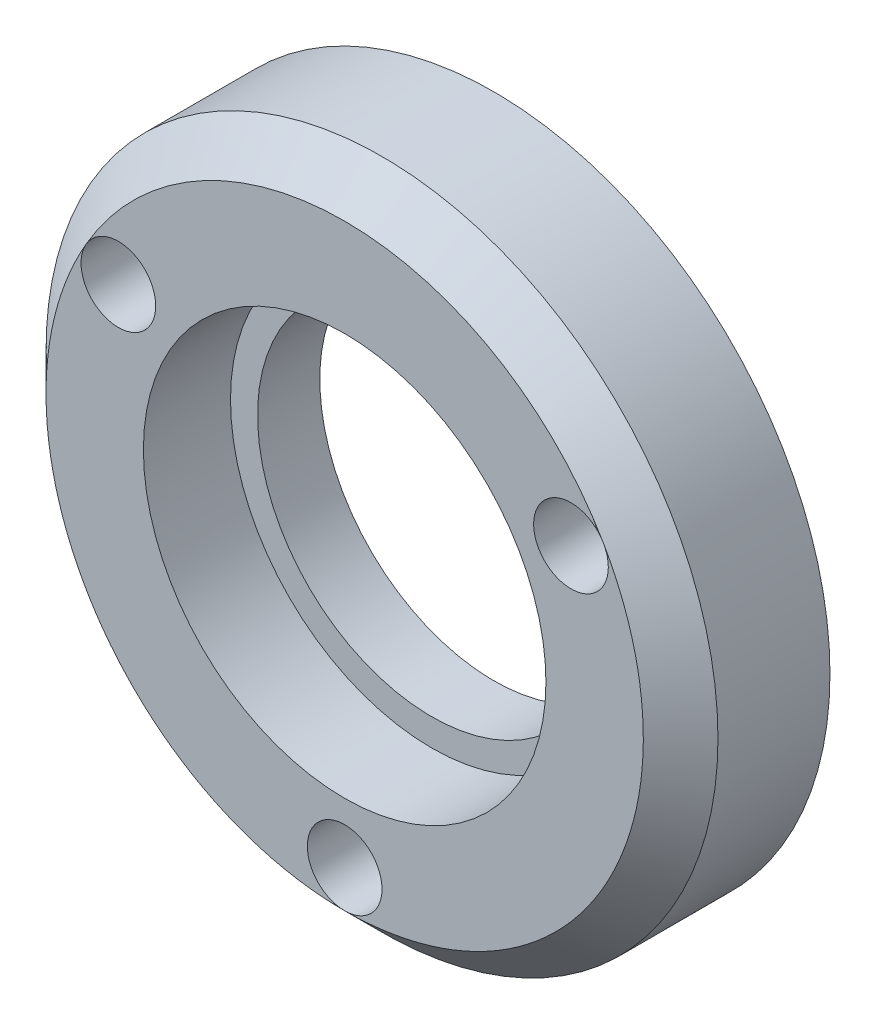
ISO-10303-21;
HEADER;
FILE_DESCRIPTION(('STEP AP214'),'2;1');
FILE_NAME('part.step','',(''),(''),'','','');
FILE_SCHEMA(('AUTOMOTIVE_DESIGN { 1 0 10303 214 1 1 1 1 }'));
ENDSEC;
DATA;
#1=APPLICATION_CONTEXT('core data for automotive mechanical design processes');
#2=APPLICATION_PROTOCOL_DEFINITION('international standard','automotive_design',2000,#1);
#3=PRODUCT_CONTEXT('',#1,'mechanical');
#4=PRODUCT('Part','Part','',(#3));
#5=PRODUCT_RELATED_PRODUCT_CATEGORY('part','',(#4));
#6=PRODUCT_DEFINITION_FORMATION('','',#4);
#7=PRODUCT_DEFINITION_CONTEXT('part definition',#1,'design');
#8=PRODUCT_DEFINITION('design','',#6,#7);
#9=PRODUCT_DEFINITION_SHAPE('','',#8);
#10=(LENGTH_UNIT() NAMED_UNIT(*) SI_UNIT(.MILLI.,.METRE.));
#11=(NAMED_UNIT(*) PLANE_ANGLE_UNIT() SI_UNIT($,.RADIAN.));
#12=(NAMED_UNIT(*) SI_UNIT($,.STERADIAN.) SOLID_ANGLE_UNIT());
#13=UNCERTAINTY_MEASURE_WITH_UNIT(LENGTH_MEASURE(1.E-05),#10,'distance_accuracy_value','');
#14=(GEOMETRIC_REPRESENTATION_CONTEXT(3) GLOBAL_UNCERTAINTY_ASSIGNED_CONTEXT((#13)) GLOBAL_UNIT_ASSIGNED_CONTEXT((#10,
#11,#12)) REPRESENTATION_CONTEXT('',''));
#15=CARTESIAN_POINT('',(0.,0.,0.));
#16=DIRECTION('',(0.,0.,1.));
#17=DIRECTION('',(1.,0.,0.));
#18=AXIS2_PLACEMENT_3D('',#15,#16,#17);
#19=CARTESIAN_POINT('',(0.,-21.,0.));
#20=DIRECTION('',(0.,0.,1.));
#21=DIRECTION('',(1.,0.,0.));
#22=AXIS2_PLACEMENT_3D('',#19,#20,#21);
#23=CYLINDRICAL_SURFACE('',#22,1.65);
#24=CARTESIAN_POINT('',(0.,-21.,5.49999999999999));
#25=DIRECTION('',(0.,0.,1.));
#26=DIRECTION('',(1.,0.,0.));
#27=AXIS2_PLACEMENT_3D('',#24,#25,#26);
#28=CIRCLE('',#27,1.65);
#29=CARTESIAN_POINT('',(1.65,-21.,5.49999999999999));
#30=VERTEX_POINT('',#29);
#31=EDGE_CURVE('E107',#30,#30,#28,.T.);
#32=ORIENTED_EDGE('',*,*,#31,.T.);
#33=EDGE_LOOP('',(#32));
#34=FACE_BOUND('',#33,.T.);
#35=CARTESIAN_POINT('',(0.,-21.,0.));
#36=DIRECTION('',(0.,0.,1.));
#37=DIRECTION('',(1.,0.,0.));
#38=AXIS2_PLACEMENT_3D('',#35,#36,#37);
#39=CIRCLE('',#38,1.65);
#40=CARTESIAN_POINT('',(1.65,-21.,0.));
#41=VERTEX_POINT('',#40);
#42=EDGE_CURVE('E76',#41,#41,#39,.T.);
#43=ORIENTED_EDGE('',*,*,#42,.F.);
#44=EDGE_LOOP('',(#43));
#45=FACE_BOUND('',#44,.T.);
#46=ADVANCED_FACE('F38',(#34,#45),#23,.F.);
#47=CARTESIAN_POINT('',(18.1865334794732,10.5,0.));
#48=DIRECTION('',(0.,0.,1.));
#49=DIRECTION('',(1.,0.,0.));
#50=AXIS2_PLACEMENT_3D('',#47,#48,#49);
#51=CYLINDRICAL_SURFACE('',#50,1.65);
#52=CARTESIAN_POINT('',(18.1865334794732,10.5,5.49999999999999));
#53=DIRECTION('',(0.,0.,1.));
#54=DIRECTION('',(1.,0.,0.));
#55=AXIS2_PLACEMENT_3D('',#52,#53,#54);
#56=CIRCLE('',#55,1.65);
#57=CARTESIAN_POINT('',(19.8365334794732,10.5,5.49999999999999));
#58=VERTEX_POINT('',#57);
#59=EDGE_CURVE('E110',#58,#58,#56,.T.);
#60=ORIENTED_EDGE('',*,*,#59,.T.);
#61=EDGE_LOOP('',(#60));
#62=FACE_BOUND('',#61,.T.);
#63=CARTESIAN_POINT('',(18.1865334794732,10.5,0.));
#64=DIRECTION('',(0.,0.,1.));
#65=DIRECTION('',(1.,0.,0.));
#66=AXIS2_PLACEMENT_3D('',#63,#64,#65);
#67=CIRCLE('',#66,1.65);
#68=CARTESIAN_POINT('',(19.8365334794732,10.5,0.));
#69=VERTEX_POINT('',#68);
#70=EDGE_CURVE('E84',#69,#69,#67,.T.);
#71=ORIENTED_EDGE('',*,*,#70,.F.);
#72=EDGE_LOOP('',(#71));
#73=FACE_BOUND('',#72,.T.);
#74=ADVANCED_FACE('F143',(#62,#73),#51,.F.);
#75=CARTESIAN_POINT('',(-18.1865334794732,10.5,0.));
#76=DIRECTION('',(0.,0.,1.));
#77=DIRECTION('',(1.,0.,0.));
#78=AXIS2_PLACEMENT_3D('',#75,#76,#77);
#79=CYLINDRICAL_SURFACE('',#78,1.65);
#80=CARTESIAN_POINT('',(-18.1865334794732,10.5,5.49999999999999));
#81=DIRECTION('',(0.,0.,1.));
#82=DIRECTION('',(1.,0.,0.));
#83=AXIS2_PLACEMENT_3D('',#80,#81,#82);
#84=CIRCLE('',#83,1.65);
#85=CARTESIAN_POINT('',(-16.5365334794732,10.5,5.49999999999999));
#86=VERTEX_POINT('',#85);
#87=EDGE_CURVE('E113',#86,#86,#84,.T.);
#88=ORIENTED_EDGE('',*,*,#87,.T.);
#89=EDGE_LOOP('',(#88));
#90=FACE_BOUND('',#89,.T.);
#91=CARTESIAN_POINT('',(-18.1865334794732,10.5,0.));
#92=DIRECTION('',(0.,0.,1.));
#93=DIRECTION('',(1.,0.,0.));
#94=AXIS2_PLACEMENT_3D('',#91,#92,#93);
#95=CIRCLE('',#94,1.65);
#96=CARTESIAN_POINT('',(-16.5365334794732,10.5,0.));
#97=VERTEX_POINT('',#96);
#98=EDGE_CURVE('E87',#97,#97,#95,.T.);
#99=ORIENTED_EDGE('',*,*,#98,.F.);
#100=EDGE_LOOP('',(#99));
#101=FACE_BOUND('',#100,.T.);
#102=ADVANCED_FACE('F149',(#90,#101),#79,.F.);
#103=CARTESIAN_POINT('',(0.,0.,12.));
#104=DIRECTION('',(0.,0.,-1.));
#105=DIRECTION('',(-1.,0.,0.));
#106=AXIS2_PLACEMENT_3D('',#103,#104,#105);
#107=CYLINDRICAL_SURFACE('',#106,27.);
#108=CARTESIAN_POINT('',(0.,0.,8.99999999999998));
#109=DIRECTION('',(0.,0.,1.));
#110=DIRECTION('',(1.,0.,0.));
#111=AXIS2_PLACEMENT_3D('',#108,#109,#110);
#112=CIRCLE('',#111,27.);
#113=CARTESIAN_POINT('',(27.,0.,8.99999999999998));
#114=VERTEX_POINT('',#113);
#115=EDGE_CURVE('E11',#114,#114,#112,.F.);
#116=ORIENTED_EDGE('',*,*,#115,.T.);
#117=EDGE_LOOP('',(#116));
#118=FACE_BOUND('',#117,.T.);
#119=CARTESIAN_POINT('',(0.,0.,0.));
#120=DIRECTION('',(0.,0.,1.));
#121=DIRECTION('',(1.,0.,0.));
#122=AXIS2_PLACEMENT_3D('',#119,#120,#121);
#123=CIRCLE('',#122,27.);
#124=CARTESIAN_POINT('',(27.,0.,0.));
#125=VERTEX_POINT('',#124);
#126=EDGE_CURVE('E102',#125,#125,#123,.T.);
#127=ORIENTED_EDGE('',*,*,#126,.T.);
#128=EDGE_LOOP('',(#127));
#129=FACE_BOUND('',#128,.T.);
#130=ADVANCED_FACE('F154',(#118,#129),#107,.T.);
#131=CARTESIAN_POINT('',(0.,0.,12.));
#132=DIRECTION('',(0.,0.,1.));
#133=DIRECTION('',(1.,0.,0.));
#134=AXIS2_PLACEMENT_3D('',#131,#132,#133);
#135=PLANE('',#134);
#136=CARTESIAN_POINT('',(18.1865334794732,10.5,12.));
#137=DIRECTION('',(0.,0.,1.));
#138=DIRECTION('',(1.,0.,0.));
#139=AXIS2_PLACEMENT_3D('',#136,#137,#138);
#140=CIRCLE('',#139,3.);
#141=CARTESIAN_POINT('',(20.7846096908265,12.,12.));
#142=VERTEX_POINT('',#141);
#143=EDGE_CURVE('E67',#142,#142,#140,.T.);
#144=ORIENTED_EDGE('',*,*,#143,.F.);
#145=CARTESIAN_POINT('',(0.,0.,12.));
#146=DIRECTION('',(0.,0.,1.));
#147=DIRECTION('',(1.,0.,0.));
#148=AXIS2_PLACEMENT_3D('',#145,#146,#147);
#149=CIRCLE('',#148,24.);
#150=CARTESIAN_POINT('',(-20.7846096908265,12.,12.));
#151=VERTEX_POINT('',#150);
#152=EDGE_CURVE('E46',#142,#151,#149,.T.);
#153=ORIENTED_EDGE('',*,*,#152,.T.);
#154=CARTESIAN_POINT('',(-18.1865334794732,10.5,12.));
#155=DIRECTION('',(0.,0.,1.));
#156=DIRECTION('',(1.,0.,0.));
#157=AXIS2_PLACEMENT_3D('',#154,#155,#156);
#158=CIRCLE('',#157,3.);
#159=EDGE_CURVE('E73',#151,#151,#158,.T.);
#160=ORIENTED_EDGE('',*,*,#159,.F.);
#161=CARTESIAN_POINT('',(0.,0.,12.));
#162=DIRECTION('',(0.,0.,1.));
#163=DIRECTION('',(1.,0.,0.));
#164=AXIS2_PLACEMENT_3D('',#161,#162,#163);
#165=CIRCLE('',#164,24.);
#166=CARTESIAN_POINT('',(0.,-24.,12.));
#167=VERTEX_POINT('',#166);
#168=EDGE_CURVE('E53',#151,#167,#165,.T.);
#169=ORIENTED_EDGE('',*,*,#168,.T.);
#170=CARTESIAN_POINT('',(0.,-21.,12.));
#171=DIRECTION('',(0.,0.,1.));
#172=DIRECTION('',(1.,0.,0.));
#173=AXIS2_PLACEMENT_3D('',#170,#171,#172);
#174=CIRCLE('',#173,3.);
#175=EDGE_CURVE('E68',#167,#167,#174,.T.);
#176=ORIENTED_EDGE('',*,*,#175,.F.);
#177=CARTESIAN_POINT('',(0.,0.,12.));
#178=DIRECTION('',(0.,0.,1.));
#179=DIRECTION('',(1.,0.,0.));
#180=AXIS2_PLACEMENT_3D('',#177,#178,#179);
#181=CIRCLE('',#180,24.);
#182=EDGE_CURVE('E63',#167,#142,#181,.T.);
#183=ORIENTED_EDGE('',*,*,#182,.T.);
#184=EDGE_LOOP('',(#144,#153,#160,#169,#176,#183));
#185=FACE_BOUND('',#184,.T.);
#186=CARTESIAN_POINT('',(0.,0.,12.));
#187=DIRECTION('',(0.,0.,1.));
#188=DIRECTION('',(1.,0.,0.));
#189=AXIS2_PLACEMENT_3D('',#186,#187,#188);
#190=CIRCLE('',#189,16.175);
#191=CARTESIAN_POINT('',(16.175,0.,12.));
#192=VERTEX_POINT('',#191);
#193=EDGE_CURVE('E96',#192,#192,#190,.T.);
#194=ORIENTED_EDGE('',*,*,#193,.F.);
#195=EDGE_LOOP('',(#194));
#196=FACE_BOUND('',#195,.T.);
#197=ADVANCED_FACE('F65',(#185,#196),#135,.T.);
#198=CARTESIAN_POINT('',(0.,0.,0.));
#199=DIRECTION('',(0.,0.,1.));
#200=DIRECTION('',(1.,0.,0.));
#201=AXIS2_PLACEMENT_3D('',#198,#199,#200);
#202=PLANE('',#201);
#203=CARTESIAN_POINT('',(18.1865334794732,-10.5000000000001,0.));
#204=DIRECTION('',(0.,0.,-1.));
#205=DIRECTION('',(-1.,0.,0.));
#206=AXIS2_PLACEMENT_3D('',#203,#204,#205);
#207=CIRCLE('',#206,3.65);
#208=CARTESIAN_POINT('',(14.5365334794732,-10.5000000000001,0.));
#209=VERTEX_POINT('',#208);
#210=EDGE_CURVE('E358',#209,#209,#207,.T.);
#211=ORIENTED_EDGE('',*,*,#210,.F.);
#212=EDGE_LOOP('',(#211));
#213=FACE_BOUND('',#212,.T.);
#214=CARTESIAN_POINT('',(-18.1865334794732,-10.5000000000001,0.));
#215=DIRECTION('',(0.,0.,-1.));
#216=DIRECTION('',(-1.,0.,0.));
#217=AXIS2_PLACEMENT_3D('',#214,#215,#216);
#218=CIRCLE('',#217,3.65);
#219=CARTESIAN_POINT('',(-21.8365334794732,-10.5000000000001,0.));
#220=VERTEX_POINT('',#219);
#221=EDGE_CURVE('E367',#220,#220,#218,.T.);
#222=ORIENTED_EDGE('',*,*,#221,.F.);
#223=EDGE_LOOP('',(#222));
#224=FACE_BOUND('',#223,.T.);
#225=CARTESIAN_POINT('',(0.,21.,0.));
#226=DIRECTION('',(0.,0.,-1.));
#227=DIRECTION('',(-1.,0.,0.));
#228=AXIS2_PLACEMENT_3D('',#225,#226,#227);
#229=CIRCLE('',#228,3.65);
#230=CARTESIAN_POINT('',(-3.65,21.,0.));
#231=VERTEX_POINT('',#230);
#232=EDGE_CURVE('E81',#231,#231,#229,.T.);
#233=ORIENTED_EDGE('',*,*,#232,.F.);
#234=EDGE_LOOP('',(#233));
#235=FACE_BOUND('',#234,.T.);
#236=ORIENTED_EDGE('',*,*,#70,.T.);
#237=EDGE_LOOP('',(#236));
#238=FACE_BOUND('',#237,.T.);
#239=ORIENTED_EDGE('',*,*,#42,.T.);
#240=EDGE_LOOP('',(#239));
#241=FACE_BOUND('',#240,.T.);
#242=ORIENTED_EDGE('',*,*,#98,.T.);
#243=EDGE_LOOP('',(#242));
#244=FACE_BOUND('',#243,.T.);
#245=CARTESIAN_POINT('',(0.,0.,0.));
#246=DIRECTION('',(0.,0.,1.));
#247=DIRECTION('',(1.,0.,0.));
#248=AXIS2_PLACEMENT_3D('',#245,#246,#247);
#249=CIRCLE('',#248,14.);
#250=CARTESIAN_POINT('',(14.,0.,0.));
#251=VERTEX_POINT('',#250);
#252=EDGE_CURVE('E93',#251,#251,#249,.T.);
#253=ORIENTED_EDGE('',*,*,#252,.T.);
#254=EDGE_LOOP('',(#253));
#255=FACE_BOUND('',#254,.T.);
#256=ORIENTED_EDGE('',*,*,#126,.F.);
#257=EDGE_LOOP('',(#256));
#258=FACE_BOUND('',#257,.T.);
#259=ADVANCED_FACE('F163',(#213,#224,#235,#238,#241,#244,#255,#258),#202,.F.);
#260=CARTESIAN_POINT('',(0.,0.,5.));
#261=DIRECTION('',(0.,0.,1.));
#262=DIRECTION('',(1.,0.,0.));
#263=AXIS2_PLACEMENT_3D('',#260,#261,#262);
#264=CYLINDRICAL_SURFACE('',#263,16.175);
#265=CARTESIAN_POINT('',(0.,0.,5.));
#266=DIRECTION('',(0.,0.,1.));
#267=DIRECTION('',(1.,0.,0.));
#268=AXIS2_PLACEMENT_3D('',#265,#266,#267);
#269=CIRCLE('',#268,16.175);
#270=CARTESIAN_POINT('',(16.175,0.,5.));
#271=VERTEX_POINT('',#270);
#272=EDGE_CURVE('E99',#271,#271,#269,.T.);
#273=ORIENTED_EDGE('',*,*,#272,.F.);
#274=EDGE_LOOP('',(#273));
#275=FACE_BOUND('',#274,.T.);
#276=ORIENTED_EDGE('',*,*,#193,.T.);
#277=EDGE_LOOP('',(#276));
#278=FACE_BOUND('',#277,.T.);
#279=ADVANCED_FACE('F159',(#275,#278),#264,.F.);
#280=CARTESIAN_POINT('',(0.,0.,5.));
#281=DIRECTION('',(0.,0.,1.));
#282=DIRECTION('',(1.,0.,0.));
#283=AXIS2_PLACEMENT_3D('',#280,#281,#282);
#284=PLANE('',#283);
#285=CARTESIAN_POINT('',(0.,0.,5.));
#286=DIRECTION('',(0.,0.,1.));
#287=DIRECTION('',(1.,0.,0.));
#288=AXIS2_PLACEMENT_3D('',#285,#286,#287);
#289=CIRCLE('',#288,14.);
#290=CARTESIAN_POINT('',(14.,0.,5.));
#291=VERTEX_POINT('',#290);
#292=EDGE_CURVE('E92',#291,#291,#289,.T.);
#293=ORIENTED_EDGE('',*,*,#292,.F.);
#294=EDGE_LOOP('',(#293));
#295=FACE_BOUND('',#294,.T.);
#296=ORIENTED_EDGE('',*,*,#272,.T.);
#297=EDGE_LOOP('',(#296));
#298=FACE_BOUND('',#297,.T.);
#299=ADVANCED_FACE('F137',(#295,#298),#284,.T.);
#300=CARTESIAN_POINT('',(0.,0.,0.));
#301=DIRECTION('',(0.,0.,1.));
#302=DIRECTION('',(1.,0.,0.));
#303=AXIS2_PLACEMENT_3D('',#300,#301,#302);
#304=CYLINDRICAL_SURFACE('',#303,14.);
#305=ORIENTED_EDGE('',*,*,#252,.F.);
#306=EDGE_LOOP('',(#305));
#307=FACE_BOUND('',#306,.T.);
#308=ORIENTED_EDGE('',*,*,#292,.T.);
#309=EDGE_LOOP('',(#308));
#310=FACE_BOUND('',#309,.T.);
#311=ADVANCED_FACE('F127',(#307,#310),#304,.F.);
#312=CARTESIAN_POINT('',(-18.1865334794732,10.5,7.));
#313=DIRECTION('',(0.,0.,1.));
#314=DIRECTION('',(1.,0.,0.));
#315=AXIS2_PLACEMENT_3D('',#312,#313,#314);
#316=CYLINDRICAL_SURFACE('',#315,3.);
#317=CARTESIAN_POINT('',(-18.1865334794732,10.5,6.84999999999997));
#318=DIRECTION('',(0.,0.,1.));
#319=DIRECTION('',(1.,0.,0.));
#320=AXIS2_PLACEMENT_3D('',#317,#318,#319);
#321=CIRCLE('',#320,3.);
#322=CARTESIAN_POINT('',(-15.1865334794732,10.5,6.84999999999997));
#323=VERTEX_POINT('',#322);
#324=EDGE_CURVE('E69',#323,#323,#321,.F.);
#325=ORIENTED_EDGE('',*,*,#324,.T.);
#326=EDGE_LOOP('',(#325));
#327=FACE_BOUND('',#326,.T.);
#328=ORIENTED_EDGE('',*,*,#159,.T.);
#329=EDGE_LOOP('',(#328));
#330=FACE_BOUND('',#329,.T.);
#331=ADVANCED_FACE('F125',(#327,#330),#316,.F.);
#332=CARTESIAN_POINT('',(18.1865334794732,10.5,7.));
#333=DIRECTION('',(0.,0.,1.));
#334=DIRECTION('',(1.,0.,0.));
#335=AXIS2_PLACEMENT_3D('',#332,#333,#334);
#336=CYLINDRICAL_SURFACE('',#335,3.);
#337=CARTESIAN_POINT('',(18.1865334794732,10.5,6.84999999999998));
#338=DIRECTION('',(0.,0.,1.));
#339=DIRECTION('',(1.,0.,0.));
#340=AXIS2_PLACEMENT_3D('',#337,#338,#339);
#341=CIRCLE('',#340,3.);
#342=CARTESIAN_POINT('',(21.1865334794732,10.5,6.84999999999998));
#343=VERTEX_POINT('',#342);
#344=EDGE_CURVE('E119',#343,#343,#341,.F.);
#345=ORIENTED_EDGE('',*,*,#344,.T.);
#346=EDGE_LOOP('',(#345));
#347=FACE_BOUND('',#346,.T.);
#348=ORIENTED_EDGE('',*,*,#143,.T.);
#349=EDGE_LOOP('',(#348));
#350=FACE_BOUND('',#349,.T.);
#351=ADVANCED_FACE('F72',(#347,#350),#336,.F.);
#352=CARTESIAN_POINT('',(0.,-21.,7.));
#353=DIRECTION('',(0.,0.,1.));
#354=DIRECTION('',(1.,0.,0.));
#355=AXIS2_PLACEMENT_3D('',#352,#353,#354);
#356=CYLINDRICAL_SURFACE('',#355,3.);
#357=CARTESIAN_POINT('',(0.,-21.,6.84999999999997));
#358=DIRECTION('',(0.,0.,1.));
#359=DIRECTION('',(1.,0.,0.));
#360=AXIS2_PLACEMENT_3D('',#357,#358,#359);
#361=CIRCLE('',#360,3.);
#362=CARTESIAN_POINT('',(3.,-21.,6.84999999999997));
#363=VERTEX_POINT('',#362);
#364=EDGE_CURVE('E116',#363,#363,#361,.F.);
#365=ORIENTED_EDGE('',*,*,#364,.T.);
#366=EDGE_LOOP('',(#365));
#367=FACE_BOUND('',#366,.T.);
#368=ORIENTED_EDGE('',*,*,#175,.T.);
#369=EDGE_LOOP('',(#368));
#370=FACE_BOUND('',#369,.T.);
#371=ADVANCED_FACE('F134',(#367,#370),#356,.F.);
#372=CARTESIAN_POINT('',(0.,-21.,7.));
#373=DIRECTION('',(0.,0.,1.));
#374=DIRECTION('',(1.,0.,0.));
#375=AXIS2_PLACEMENT_3D('',#372,#373,#374);
#376=CONICAL_SURFACE('',#375,3.15000000000003,0.785398163397453);
#377=ORIENTED_EDGE('',*,*,#31,.F.);
#378=EDGE_LOOP('',(#377));
#379=FACE_BOUND('',#378,.T.);
#380=ORIENTED_EDGE('',*,*,#364,.F.);
#381=EDGE_LOOP('',(#380));
#382=FACE_BOUND('',#381,.T.);
#383=ADVANCED_FACE('F173',(#379,#382),#376,.F.);
#384=CARTESIAN_POINT('',(18.1865334794732,10.5,7.));
#385=DIRECTION('',(0.,0.,1.));
#386=DIRECTION('',(1.,0.,0.));
#387=AXIS2_PLACEMENT_3D('',#384,#385,#386);
#388=CONICAL_SURFACE('',#387,3.15000000000002,0.785398163397453);
#389=ORIENTED_EDGE('',*,*,#59,.F.);
#390=EDGE_LOOP('',(#389));
#391=FACE_BOUND('',#390,.T.);
#392=ORIENTED_EDGE('',*,*,#344,.F.);
#393=EDGE_LOOP('',(#392));
#394=FACE_BOUND('',#393,.T.);
#395=ADVANCED_FACE('F176',(#391,#394),#388,.F.);
#396=CARTESIAN_POINT('',(-18.1865334794732,10.5,7.));
#397=DIRECTION('',(0.,0.,1.));
#398=DIRECTION('',(1.,0.,0.));
#399=AXIS2_PLACEMENT_3D('',#396,#397,#398);
#400=CONICAL_SURFACE('',#399,3.15000000000002,0.785398163397453);
#401=ORIENTED_EDGE('',*,*,#87,.F.);
#402=EDGE_LOOP('',(#401));
#403=FACE_BOUND('',#402,.T.);
#404=ORIENTED_EDGE('',*,*,#324,.F.);
#405=EDGE_LOOP('',(#404));
#406=FACE_BOUND('',#405,.T.);
#407=ADVANCED_FACE('F179',(#403,#406),#400,.F.);
#408=CARTESIAN_POINT('',(0.,0.,12.));
#409=DIRECTION('',(0.,0.,-1.));
#410=DIRECTION('',(-1.,0.,0.));
#411=AXIS2_PLACEMENT_3D('',#408,#409,#410);
#412=CONICAL_SURFACE('',#411,24.,0.785398163397445);
#413=ORIENTED_EDGE('',*,*,#115,.F.);
#414=EDGE_LOOP('',(#413));
#415=FACE_BOUND('',#414,.T.);
#416=ORIENTED_EDGE('',*,*,#168,.F.);
#417=ORIENTED_EDGE('',*,*,#152,.F.);
#418=ORIENTED_EDGE('',*,*,#182,.F.);
#419=EDGE_LOOP('',(#416,#417,#418));
#420=FACE_BOUND('',#419,.T.);
#421=ADVANCED_FACE('F40',(#415,#420),#412,.T.);
#422=CARTESIAN_POINT('',(0.,21.,3.));
#423=DIRECTION('',(0.,0.,-1.));
#424=DIRECTION('',(-1.,0.,0.));
#425=AXIS2_PLACEMENT_3D('',#422,#423,#424);
#426=CYLINDRICAL_SURFACE('',#425,3.65);
#427=CARTESIAN_POINT('',(0.,21.,3.));
#428=DIRECTION('',(0.,0.,-1.));
#429=DIRECTION('',(-1.,0.,0.));
#430=AXIS2_PLACEMENT_3D('',#427,#428,#429);
#431=CIRCLE('',#430,3.65);
#432=CARTESIAN_POINT('',(-3.65,21.,3.));
#433=VERTEX_POINT('',#432);
#434=EDGE_CURVE('E78',#433,#433,#431,.T.);
#435=ORIENTED_EDGE('',*,*,#434,.F.);
#436=EDGE_LOOP('',(#435));
#437=FACE_BOUND('',#436,.T.);
#438=ORIENTED_EDGE('',*,*,#232,.T.);
#439=EDGE_LOOP('',(#438));
#440=FACE_BOUND('',#439,.T.);
#441=ADVANCED_FACE('F186',(#437,#440),#426,.F.);
#442=CARTESIAN_POINT('',(0.,21.,3.));
#443=DIRECTION('',(0.,0.,-1.));
#444=DIRECTION('',(-1.,0.,0.));
#445=AXIS2_PLACEMENT_3D('',#442,#443,#444);
#446=PLANE('',#445);
#447=ORIENTED_EDGE('',*,*,#434,.T.);
#448=EDGE_LOOP('',(#447));
#449=FACE_BOUND('',#448,.T.);
#450=ADVANCED_FACE('F208',(#449),#446,.T.);
#451=CARTESIAN_POINT('',(-18.1865334794732,-10.5000000000001,3.));
#452=DIRECTION('',(0.,0.,-1.));
#453=DIRECTION('',(-1.,0.,0.));
#454=AXIS2_PLACEMENT_3D('',#451,#452,#453);
#455=CYLINDRICAL_SURFACE('',#454,3.65);
#456=CARTESIAN_POINT('',(-18.1865334794732,-10.5000000000001,3.));
#457=DIRECTION('',(0.,0.,-1.));
#458=DIRECTION('',(-1.,0.,0.));
#459=AXIS2_PLACEMENT_3D('',#456,#457,#458);
#460=CIRCLE('',#459,3.65);
#461=CARTESIAN_POINT('',(-21.8365334794732,-10.5000000000001,3.));
#462=VERTEX_POINT('',#461);
#463=EDGE_CURVE('E362',#462,#462,#460,.T.);
#464=ORIENTED_EDGE('',*,*,#463,.F.);
#465=EDGE_LOOP('',(#464));
#466=FACE_BOUND('',#465,.T.);
#467=ORIENTED_EDGE('',*,*,#221,.T.);
#468=EDGE_LOOP('',(#467));
#469=FACE_BOUND('',#468,.T.);
#470=ADVANCED_FACE('F215',(#466,#469),#455,.F.);
#471=CARTESIAN_POINT('',(-18.1865334794732,-10.5000000000001,3.));
#472=DIRECTION('',(0.,0.,-1.));
#473=DIRECTION('',(-1.,0.,0.));
#474=AXIS2_PLACEMENT_3D('',#471,#472,#473);
#475=PLANE('',#474);
#476=ORIENTED_EDGE('',*,*,#463,.T.);
#477=EDGE_LOOP('',(#476));
#478=FACE_BOUND('',#477,.T.);
#479=ADVANCED_FACE('F322',(#478),#475,.T.);
#480=CARTESIAN_POINT('',(18.1865334794732,-10.5000000000001,3.));
#481=DIRECTION('',(0.,0.,-1.));
#482=DIRECTION('',(-1.,0.,0.));
#483=AXIS2_PLACEMENT_3D('',#480,#481,#482);
#484=CYLINDRICAL_SURFACE('',#483,3.65);
#485=CARTESIAN_POINT('',(18.1865334794732,-10.5000000000001,3.));
#486=DIRECTION('',(0.,0.,-1.));
#487=DIRECTION('',(-1.,0.,0.));
#488=AXIS2_PLACEMENT_3D('',#485,#486,#487);
#489=CIRCLE('',#488,3.65);
#490=CARTESIAN_POINT('',(14.5365334794732,-10.5000000000001,3.));
#491=VERTEX_POINT('',#490);
#492=EDGE_CURVE('E357',#491,#491,#489,.T.);
#493=ORIENTED_EDGE('',*,*,#492,.F.);
#494=EDGE_LOOP('',(#493));
#495=FACE_BOUND('',#494,.T.);
#496=ORIENTED_EDGE('',*,*,#210,.T.);
#497=EDGE_LOOP('',(#496));
#498=FACE_BOUND('',#497,.T.);
#499=ADVANCED_FACE('F331',(#495,#498),#484,.F.);
#500=CARTESIAN_POINT('',(18.1865334794732,-10.5000000000001,3.));
#501=DIRECTION('',(0.,0.,-1.));
#502=DIRECTION('',(-1.,0.,0.));
#503=AXIS2_PLACEMENT_3D('',#500,#501,#502);
#504=PLANE('',#503);
#505=ORIENTED_EDGE('',*,*,#492,.T.);
#506=EDGE_LOOP('',(#505));
#507=FACE_BOUND('',#506,.T.);
#508=ADVANCED_FACE('F341',(#507),#504,.T.);
#509=CLOSED_SHELL('',(#46,#74,#102,#130,#197,#259,#279,#299,#311,#331,#351,#371,#383,#395,#407,
#421,#441,#450,#470,#479,#499,#508));
#510=MANIFOLD_SOLID_BREP('B2',#509);
#511=ADVANCED_BREP_SHAPE_REPRESENTATION('',(#18,#510),#14);
#512=SHAPE_DEFINITION_REPRESENTATION(#9,#511);
ENDSEC;
END-ISO-10303-21;
